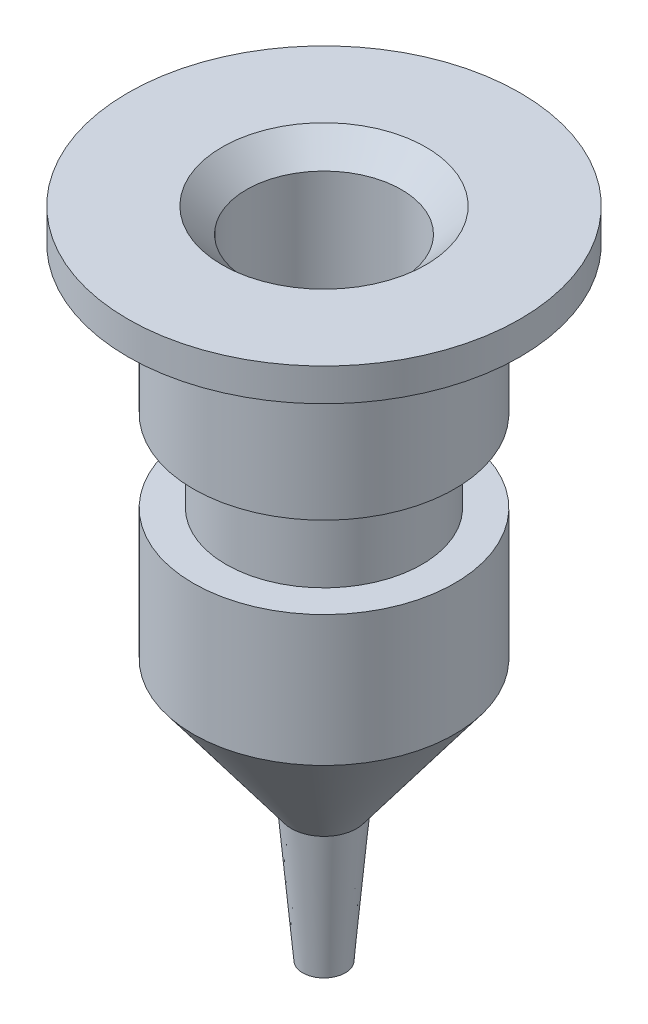
ISO-10303-21;
HEADER;
FILE_DESCRIPTION(('STEP AP214'),'2;1');
FILE_NAME('part.step','',(''),(''),'','','');
FILE_SCHEMA(('AUTOMOTIVE_DESIGN { 1 0 10303 214 1 1 1 1 }'));
ENDSEC;
DATA;
#1=APPLICATION_CONTEXT('core data for automotive mechanical design processes');
#2=APPLICATION_PROTOCOL_DEFINITION('international standard','automotive_design',2000,#1);
#3=PRODUCT_CONTEXT('',#1,'mechanical');
#4=PRODUCT('Part','Part','',(#3));
#5=PRODUCT_RELATED_PRODUCT_CATEGORY('part','',(#4));
#6=PRODUCT_DEFINITION_FORMATION('','',#4);
#7=PRODUCT_DEFINITION_CONTEXT('part definition',#1,'design');
#8=PRODUCT_DEFINITION('design','',#6,#7);
#9=PRODUCT_DEFINITION_SHAPE('','',#8);
#10=(LENGTH_UNIT() NAMED_UNIT(*) SI_UNIT(.MILLI.,.METRE.));
#11=(NAMED_UNIT(*) PLANE_ANGLE_UNIT() SI_UNIT($,.RADIAN.));
#12=(NAMED_UNIT(*) SI_UNIT($,.STERADIAN.) SOLID_ANGLE_UNIT());
#13=UNCERTAINTY_MEASURE_WITH_UNIT(LENGTH_MEASURE(1.E-05),#10,'distance_accuracy_value','');
#14=(GEOMETRIC_REPRESENTATION_CONTEXT(3) GLOBAL_UNCERTAINTY_ASSIGNED_CONTEXT((#13)) GLOBAL_UNIT_ASSIGNED_CONTEXT((#10,
#11,#12)) REPRESENTATION_CONTEXT('',''));
#15=CARTESIAN_POINT('',(0.,0.,0.));
#16=DIRECTION('',(0.,0.,1.));
#17=DIRECTION('',(1.,0.,0.));
#18=AXIS2_PLACEMENT_3D('',#15,#16,#17);
#19=CARTESIAN_POINT('',(3.,12.,0.));
#20=DIRECTION('',(0.,1.,0.));
#21=DIRECTION('',(0.,0.,1.));
#22=AXIS2_PLACEMENT_3D('',#19,#20,#21);
#23=PLANE('',#22);
#24=CARTESIAN_POINT('',(0.,12.,0.));
#25=DIRECTION('',(0.,1.,0.));
#26=DIRECTION('',(0.,0.,1.));
#27=AXIS2_PLACEMENT_3D('',#24,#25,#26);
#28=CIRCLE('',#27,4.00000000000001);
#29=CARTESIAN_POINT('',(0.,12.,4.00000000000001));
#30=VERTEX_POINT('',#29);
#31=EDGE_CURVE('E10',#30,#30,#28,.T.);
#32=ORIENTED_EDGE('',*,*,#31,.T.);
#33=EDGE_LOOP('',(#32));
#34=FACE_BOUND('',#33,.T.);
#35=CARTESIAN_POINT('',(0.,12.,0.));
#36=DIRECTION('',(0.,1.,0.));
#37=DIRECTION('',(0.,0.,1.));
#38=AXIS2_PLACEMENT_3D('',#35,#36,#37);
#39=CIRCLE('',#38,3.);
#40=CARTESIAN_POINT('',(0.,12.,3.));
#41=VERTEX_POINT('',#40);
#42=EDGE_CURVE('E86',#41,#41,#39,.T.);
#43=ORIENTED_EDGE('',*,*,#42,.F.);
#44=EDGE_LOOP('',(#43));
#45=FACE_BOUND('',#44,.T.);
#46=ADVANCED_FACE('F31',(#34,#45),#23,.T.);
#47=CARTESIAN_POINT('',(0.,0.,0.));
#48=DIRECTION('',(0.,1.,0.));
#49=DIRECTION('',(0.,0.,1.));
#50=AXIS2_PLACEMENT_3D('',#47,#48,#49);
#51=CYLINDRICAL_SURFACE('',#50,4.00000000000001);
#52=CARTESIAN_POINT('',(0.,8.0000000000382,0.));
#53=DIRECTION('',(0.,1.,0.));
#54=DIRECTION('',(0.,0.,1.));
#55=AXIS2_PLACEMENT_3D('',#52,#53,#54);
#56=CIRCLE('',#55,4.00000000000001);
#57=CARTESIAN_POINT('',(0.,8.0000000000382,4.00000000000001));
#58=VERTEX_POINT('',#57);
#59=EDGE_CURVE('E37',#58,#58,#56,.T.);
#60=ORIENTED_EDGE('',*,*,#59,.T.);
#61=EDGE_LOOP('',(#60));
#62=FACE_BOUND('',#61,.T.);
#63=ORIENTED_EDGE('',*,*,#31,.F.);
#64=EDGE_LOOP('',(#63));
#65=FACE_BOUND('',#64,.T.);
#66=ADVANCED_FACE('F94',(#62,#65),#51,.T.);
#67=CARTESIAN_POINT('',(0.,8.0000000000382,0.));
#68=DIRECTION('',(0.,1.,0.));
#69=DIRECTION('',(0.,0.,1.));
#70=AXIS2_PLACEMENT_3D('',#67,#68,#69);
#71=CONICAL_SURFACE('',#70,4.00000000000001,0.643501108796695);
#72=CARTESIAN_POINT('',(0.,4.0000000000191,0.));
#73=DIRECTION('',(0.,1.,0.));
#74=DIRECTION('',(0.,0.,1.));
#75=AXIS2_PLACEMENT_3D('',#72,#73,#74);
#76=CIRCLE('',#75,0.999999999964369);
#77=CARTESIAN_POINT('',(0.,4.0000000000191,0.999999999964369));
#78=VERTEX_POINT('',#77);
#79=EDGE_CURVE('E41',#78,#78,#76,.T.);
#80=CARTESIAN_POINT('',(0.,4.0000000000191,0.999999999964369));
#81=CARTESIAN_POINT('',(0.,4.04166666668597,1.03124999996474));
#82=CARTESIAN_POINT('',(0.,4.08333333335283,1.06249999996511));
#83=CARTESIAN_POINT('',(0.,4.16666666668656,1.12499999996585));
#84=CARTESIAN_POINT('',(0.,4.20833333335343,1.15624999996623));
#85=CARTESIAN_POINT('',(0.,4.29166666668716,1.21874999996697));
#86=CARTESIAN_POINT('',(0.,4.33333333335402,1.24999999996734));
#87=CARTESIAN_POINT('',(0.,4.41666666668776,1.31249999996808));
#88=CARTESIAN_POINT('',(0.,4.45833333335462,1.34374999996845));
#89=CARTESIAN_POINT('',(0.,4.54166666668835,1.4062499999692));
#90=CARTESIAN_POINT('',(0.,4.58333333335522,1.43749999996957));
#91=CARTESIAN_POINT('',(0.,4.66666666668895,1.49999999997031));
#92=CARTESIAN_POINT('',(0.,4.70833333335581,1.53124999997068));
#93=CARTESIAN_POINT('',(0.,4.79166666668955,1.59374999997142));
#94=CARTESIAN_POINT('',(0.,4.83333333335641,1.62499999997179));
#95=CARTESIAN_POINT('',(0.,4.91666666669014,1.68749999997254));
#96=CARTESIAN_POINT('',(0.,4.95833333335701,1.71874999997291));
#97=CARTESIAN_POINT('',(0.,5.04166666669074,1.78124999997365));
#98=CARTESIAN_POINT('',(0.,5.08333333335761,1.81249999997402));
#99=CARTESIAN_POINT('',(0.,5.16666666669134,1.87499999997476));
#100=CARTESIAN_POINT('',(0.,5.2083333333582,1.90624999997514));
#101=CARTESIAN_POINT('',(0.,5.29166666669193,1.96874999997588));
#102=CARTESIAN_POINT('',(0.,5.3333333333588,1.99999999997625));
#103=CARTESIAN_POINT('',(0.,5.41666666669253,2.06249999997699));
#104=CARTESIAN_POINT('',(0.,5.4583333333594,2.09374999997736));
#105=CARTESIAN_POINT('',(0.,5.54166666669313,2.15624999997811));
#106=CARTESIAN_POINT('',(0.,5.58333333335999,2.18749999997848));
#107=CARTESIAN_POINT('',(0.,5.66666666669372,2.24999999997922));
#108=CARTESIAN_POINT('',(0.,5.70833333336059,2.28124999997959));
#109=CARTESIAN_POINT('',(0.,5.79166666669432,2.34374999998033));
#110=CARTESIAN_POINT('',(0.,5.83333333336119,2.3749999999807));
#111=CARTESIAN_POINT('',(0.,5.91666666669492,2.43749999998145));
#112=CARTESIAN_POINT('',(0.,5.95833333336178,2.46874999998182));
#113=CARTESIAN_POINT('',(0.,6.04166666669551,2.53124999998256));
#114=CARTESIAN_POINT('',(0.,6.08333333336238,2.56249999998293));
#115=CARTESIAN_POINT('',(0.,6.16666666669611,2.62499999998367));
#116=CARTESIAN_POINT('',(0.,6.20833333336298,2.65624999998405));
#117=CARTESIAN_POINT('',(0.,6.29166666669671,2.71874999998479));
#118=CARTESIAN_POINT('',(0.,6.33333333336357,2.74999999998516));
#119=CARTESIAN_POINT('',(0.,6.41666666669731,2.8124999999859));
#120=CARTESIAN_POINT('',(0.,6.45833333336417,2.84374999998627));
#121=CARTESIAN_POINT('',(0.,6.5416666666979,2.90624999998702));
#122=CARTESIAN_POINT('',(0.,6.58333333336477,2.93749999998739));
#123=CARTESIAN_POINT('',(0.,6.6666666666985,2.99999999998813));
#124=CARTESIAN_POINT('',(0.,6.70833333336536,3.0312499999885));
#125=CARTESIAN_POINT('',(0.,6.7916666666991,3.09374999998924));
#126=CARTESIAN_POINT('',(0.,6.83333333336596,3.12499999998961));
#127=CARTESIAN_POINT('',(0.,6.91666666669969,3.18749999999036));
#128=CARTESIAN_POINT('',(0.,6.95833333336656,3.21874999999073));
#129=CARTESIAN_POINT('',(0.,7.04166666670029,3.28124999999147));
#130=CARTESIAN_POINT('',(0.,7.08333333336715,3.31249999999184));
#131=CARTESIAN_POINT('',(0.,7.16666666670089,3.37499999999258));
#132=CARTESIAN_POINT('',(0.,7.20833333336775,3.40624999999296));
#133=CARTESIAN_POINT('',(0.,7.29166666670148,3.4687499999937));
#134=CARTESIAN_POINT('',(0.,7.33333333336835,3.49999999999407));
#135=CARTESIAN_POINT('',(0.,7.41666666670208,3.56249999999481));
#136=CARTESIAN_POINT('',(0.,7.45833333336894,3.59374999999518));
#137=CARTESIAN_POINT('',(0.,7.54166666670268,3.65624999999593));
#138=CARTESIAN_POINT('',(0.,7.58333333336954,3.6874999999963));
#139=CARTESIAN_POINT('',(0.,7.66666666670327,3.74999999999704));
#140=CARTESIAN_POINT('',(0.,7.70833333337014,3.78124999999741));
#141=CARTESIAN_POINT('',(0.,7.79166666670387,3.84374999999815));
#142=CARTESIAN_POINT('',(0.,7.83333333337074,3.87499999999852));
#143=CARTESIAN_POINT('',(0.,7.91666666670447,3.93749999999927));
#144=CARTESIAN_POINT('',(0.,7.95833333337133,3.96874999999964));
#145=CARTESIAN_POINT('',(0.,8.0000000000382,4.00000000000001));
#146=B_SPLINE_CURVE_WITH_KNOTS('',3,(#80,#81,#82,#83,#84,#85,#86,#87,#88,#89,#90,#91,#92,#93,
#94,#95,#96,#97,#98,#99,#100,#101,#102,#103,#104,#105,#106,#107,#108,#109,#110,#111,#112,#113,
#114,#115,#116,#117,#118,#119,#120,#121,#122,#123,#124,#125,#126,#127,#128,#129,#130,#131,#132,
#133,#134,#135,#136,#137,#138,#139,#140,#141,#142,#143,#144,#145),.UNSPECIFIED.,.F.,.F.,(4,2,2,
2,2,2,2,2,2,2,2,2,2,2,2,2,2,2,2,2,2,2,2,2,2,2,2,2,2,2,2,2,4),(0.,0.156250000001146,
0.312500000002292,0.468750000003437,0.625000000004583,0.781250000005729,0.937500000006875,
1.09375000000802,1.25000000000917,1.40625000001031,1.56250000001146,1.7187500000126,
1.87500000001375,2.03125000001489,2.18750000001604,2.34375000001719,2.50000000001833,
2.65625000001948,2.81250000002062,2.96875000002177,3.12500000002292,3.28125000002406,
3.43750000002521,3.59375000002635,3.7500000000275,3.90625000002864,4.06250000002979,
4.21875000003094,4.37500000003208,4.53125000003323,4.68750000003437,4.84375000003552,
5.00000000003667),.UNSPECIFIED.);
#147=EDGE_CURVE('BSEAM98',#78,#58,#146,.T.);
#148=ORIENTED_EDGE('',*,*,#79,.T.);
#149=ORIENTED_EDGE('',*,*,#59,.F.);
#150=ORIENTED_EDGE('',*,*,#147,.T.);
#151=ORIENTED_EDGE('',*,*,#147,.F.);
#152=EDGE_LOOP('',(#148,#150,#149,#151));
#153=FACE_BOUND('',#152,.T.);
#154=ADVANCED_FACE('F98',(#153),#71,.T.);
#155=CARTESIAN_POINT('',(0.,4.0000000000191,0.));
#156=DIRECTION('',(0.,1.,0.));
#157=DIRECTION('',(0.,0.,1.));
#158=AXIS2_PLACEMENT_3D('',#155,#156,#157);
#159=CONICAL_SURFACE('',#158,0.999999999964369,0.0872777129484037);
#160=CARTESIAN_POINT('',(0.,0.,0.));
#161=DIRECTION('',(0.,1.,0.));
#162=DIRECTION('',(0.,0.,1.));
#163=AXIS2_PLACEMENT_3D('',#160,#161,#162);
#164=CIRCLE('',#163,0.649999999966961);
#165=CARTESIAN_POINT('',(0.,0.,0.649999999966961));
#166=VERTEX_POINT('',#165);
#167=EDGE_CURVE('E45',#166,#166,#164,.T.);
#168=ORIENTED_EDGE('',*,*,#167,.T.);
#169=EDGE_LOOP('',(#168));
#170=FACE_BOUND('',#169,.T.);
#171=ORIENTED_EDGE('',*,*,#79,.F.);
#172=EDGE_LOOP('',(#171));
#173=FACE_BOUND('',#172,.T.);
#174=ADVANCED_FACE('F102',(#170,#173),#159,.T.);
#175=CARTESIAN_POINT('',(0.649999999966961,0.,0.));
#176=DIRECTION('',(0.,-1.,0.));
#177=DIRECTION('',(0.,0.,-1.));
#178=AXIS2_PLACEMENT_3D('',#175,#176,#177);
#179=PLANE('',#178);
#180=CARTESIAN_POINT('',(0.,0.,0.));
#181=DIRECTION('',(0.,1.,0.));
#182=DIRECTION('',(0.,0.,1.));
#183=AXIS2_PLACEMENT_3D('',#180,#181,#182);
#184=CIRCLE('',#183,0.400000000103073);
#185=CARTESIAN_POINT('',(0.,0.,0.400000000103073));
#186=VERTEX_POINT('',#185);
#187=EDGE_CURVE('E50',#186,#186,#184,.T.);
#188=ORIENTED_EDGE('',*,*,#187,.T.);
#189=EDGE_LOOP('',(#188));
#190=FACE_BOUND('',#189,.T.);
#191=ORIENTED_EDGE('',*,*,#167,.F.);
#192=EDGE_LOOP('',(#191));
#193=FACE_BOUND('',#192,.T.);
#194=ADVANCED_FACE('F109',(#190,#193),#179,.T.);
#195=CARTESIAN_POINT('',(0.,0.,0.));
#196=DIRECTION('',(0.,1.,0.));
#197=DIRECTION('',(0.,0.,1.));
#198=AXIS2_PLACEMENT_3D('',#195,#196,#197);
#199=CYLINDRICAL_SURFACE('',#198,0.400000000103073);
#200=CARTESIAN_POINT('',(0.,4.99999999995186,0.));
#201=DIRECTION('',(0.,1.,0.));
#202=DIRECTION('',(0.,0.,1.));
#203=AXIS2_PLACEMENT_3D('',#200,#201,#202);
#204=CIRCLE('',#203,0.400000000103073);
#205=CARTESIAN_POINT('',(0.,4.99999999995186,0.400000000103073));
#206=VERTEX_POINT('',#205);
#207=EDGE_CURVE('E53',#206,#206,#204,.T.);
#208=ORIENTED_EDGE('',*,*,#207,.T.);
#209=EDGE_LOOP('',(#208));
#210=FACE_BOUND('',#209,.T.);
#211=ORIENTED_EDGE('',*,*,#187,.F.);
#212=EDGE_LOOP('',(#211));
#213=FACE_BOUND('',#212,.T.);
#214=ADVANCED_FACE('F113',(#210,#213),#199,.F.);
#215=CARTESIAN_POINT('',(0.,4.99999999995186,0.));
#216=DIRECTION('',(0.,1.,0.));
#217=DIRECTION('',(0.,0.,1.));
#218=AXIS2_PLACEMENT_3D('',#215,#216,#217);
#219=CONICAL_SURFACE('',#218,0.400000000103073,1.0471975511966);
#220=CARTESIAN_POINT('',(0.,5.34641016146102,0.));
#221=DIRECTION('',(0.,1.,0.));
#222=DIRECTION('',(0.,0.,1.));
#223=AXIS2_PLACEMENT_3D('',#220,#221,#222);
#224=CIRCLE('',#223,1.00000000009508);
#225=CARTESIAN_POINT('',(0.,5.34641016146102,1.00000000009508));
#226=VERTEX_POINT('',#225);
#227=EDGE_CURVE('E56',#226,#226,#224,.T.);
#228=ORIENTED_EDGE('',*,*,#227,.T.);
#229=EDGE_LOOP('',(#228));
#230=FACE_BOUND('',#229,.T.);
#231=ORIENTED_EDGE('',*,*,#207,.F.);
#232=EDGE_LOOP('',(#231));
#233=FACE_BOUND('',#232,.T.);
#234=ADVANCED_FACE('F117',(#230,#233),#219,.F.);
#235=CARTESIAN_POINT('',(0.,0.,0.));
#236=DIRECTION('',(0.,1.,0.));
#237=DIRECTION('',(0.,0.,1.));
#238=AXIS2_PLACEMENT_3D('',#235,#236,#237);
#239=CYLINDRICAL_SURFACE('',#238,1.00000000009508);
#240=CARTESIAN_POINT('',(0.,9.999999999995,0.));
#241=DIRECTION('',(0.,1.,0.));
#242=DIRECTION('',(0.,0.,1.));
#243=AXIS2_PLACEMENT_3D('',#240,#241,#242);
#244=CIRCLE('',#243,1.00000000009508);
#245=CARTESIAN_POINT('',(0.,9.999999999995,1.00000000009508));
#246=VERTEX_POINT('',#245);
#247=EDGE_CURVE('E59',#246,#246,#244,.T.);
#248=ORIENTED_EDGE('',*,*,#247,.T.);
#249=EDGE_LOOP('',(#248));
#250=FACE_BOUND('',#249,.T.);
#251=ORIENTED_EDGE('',*,*,#227,.F.);
#252=EDGE_LOOP('',(#251));
#253=FACE_BOUND('',#252,.T.);
#254=ADVANCED_FACE('F121',(#250,#253),#239,.F.);
#255=CARTESIAN_POINT('',(0.,9.999999999995,0.));
#256=DIRECTION('',(0.,1.,0.));
#257=DIRECTION('',(0.,0.,1.));
#258=AXIS2_PLACEMENT_3D('',#255,#256,#257);
#259=CONICAL_SURFACE('',#258,1.00000000009508,1.0471975511966);
#260=CARTESIAN_POINT('',(0.,10.7909698687585,0.));
#261=DIRECTION('',(0.,1.,0.));
#262=DIRECTION('',(0.,0.,1.));
#263=AXIS2_PLACEMENT_3D('',#260,#261,#262);
#264=CIRCLE('',#263,2.37000000004951);
#265=CARTESIAN_POINT('',(0.,10.7909698687585,2.37000000004951));
#266=VERTEX_POINT('',#265);
#267=EDGE_CURVE('E62',#266,#266,#264,.T.);
#268=ORIENTED_EDGE('',*,*,#267,.T.);
#269=EDGE_LOOP('',(#268));
#270=FACE_BOUND('',#269,.T.);
#271=ORIENTED_EDGE('',*,*,#247,.F.);
#272=EDGE_LOOP('',(#271));
#273=FACE_BOUND('',#272,.T.);
#274=ADVANCED_FACE('F125',(#270,#273),#259,.F.);
#275=CARTESIAN_POINT('',(0.,0.,0.));
#276=DIRECTION('',(0.,1.,0.));
#277=DIRECTION('',(0.,0.,1.));
#278=AXIS2_PLACEMENT_3D('',#275,#276,#277);
#279=CYLINDRICAL_SURFACE('',#278,2.37000000004951);
#280=CARTESIAN_POINT('',(0.,19.2499999999687,0.));
#281=DIRECTION('',(0.,1.,0.));
#282=DIRECTION('',(0.,0.,1.));
#283=AXIS2_PLACEMENT_3D('',#280,#281,#282);
#284=CIRCLE('',#283,2.37000000004951);
#285=CARTESIAN_POINT('',(0.,19.2499999999687,2.37000000004951));
#286=VERTEX_POINT('',#285);
#287=EDGE_CURVE('E65',#286,#286,#284,.T.);
#288=ORIENTED_EDGE('',*,*,#287,.T.);
#289=EDGE_LOOP('',(#288));
#290=FACE_BOUND('',#289,.T.);
#291=ORIENTED_EDGE('',*,*,#267,.F.);
#292=EDGE_LOOP('',(#291));
#293=FACE_BOUND('',#292,.T.);
#294=ADVANCED_FACE('F129',(#290,#293),#279,.F.);
#295=CARTESIAN_POINT('',(0.,19.2499999999687,0.));
#296=DIRECTION('',(0.,1.,0.));
#297=DIRECTION('',(0.,0.,1.));
#298=AXIS2_PLACEMENT_3D('',#295,#296,#297);
#299=CONICAL_SURFACE('',#298,2.37000000004951,0.785398163397448);
#300=CARTESIAN_POINT('',(0.,20.,0.));
#301=DIRECTION('',(0.,1.,0.));
#302=DIRECTION('',(0.,0.,1.));
#303=AXIS2_PLACEMENT_3D('',#300,#301,#302);
#304=CIRCLE('',#303,3.12000000008084);
#305=CARTESIAN_POINT('',(0.,20.,3.12000000008084));
#306=VERTEX_POINT('',#305);
#307=EDGE_CURVE('E68',#306,#306,#304,.T.);
#308=ORIENTED_EDGE('',*,*,#307,.T.);
#309=EDGE_LOOP('',(#308));
#310=FACE_BOUND('',#309,.T.);
#311=ORIENTED_EDGE('',*,*,#287,.F.);
#312=EDGE_LOOP('',(#311));
#313=FACE_BOUND('',#312,.T.);
#314=ADVANCED_FACE('F133',(#310,#313),#299,.F.);
#315=CARTESIAN_POINT('',(3.12000000008084,20.,0.));
#316=DIRECTION('',(0.,1.,0.));
#317=DIRECTION('',(0.,0.,1.));
#318=AXIS2_PLACEMENT_3D('',#315,#316,#317);
#319=PLANE('',#318);
#320=CARTESIAN_POINT('',(0.,20.,0.));
#321=DIRECTION('',(0.,1.,0.));
#322=DIRECTION('',(0.,0.,1.));
#323=AXIS2_PLACEMENT_3D('',#320,#321,#322);
#324=CIRCLE('',#323,6.);
#325=CARTESIAN_POINT('',(0.,20.,6.));
#326=VERTEX_POINT('',#325);
#327=EDGE_CURVE('E71',#326,#326,#324,.T.);
#328=ORIENTED_EDGE('',*,*,#327,.T.);
#329=EDGE_LOOP('',(#328));
#330=FACE_BOUND('',#329,.T.);
#331=ORIENTED_EDGE('',*,*,#307,.F.);
#332=EDGE_LOOP('',(#331));
#333=FACE_BOUND('',#332,.T.);
#334=ADVANCED_FACE('F137',(#330,#333),#319,.T.);
#335=CARTESIAN_POINT('',(0.,0.,0.));
#336=DIRECTION('',(0.,1.,0.));
#337=DIRECTION('',(0.,0.,1.));
#338=AXIS2_PLACEMENT_3D('',#335,#336,#337);
#339=CYLINDRICAL_SURFACE('',#338,6.);
#340=CARTESIAN_POINT('',(0.,19.,0.));
#341=DIRECTION('',(0.,1.,0.));
#342=DIRECTION('',(0.,0.,1.));
#343=AXIS2_PLACEMENT_3D('',#340,#341,#342);
#344=CIRCLE('',#343,6.);
#345=CARTESIAN_POINT('',(0.,19.,6.));
#346=VERTEX_POINT('',#345);
#347=EDGE_CURVE('E74',#346,#346,#344,.T.);
#348=ORIENTED_EDGE('',*,*,#347,.T.);
#349=EDGE_LOOP('',(#348));
#350=FACE_BOUND('',#349,.T.);
#351=ORIENTED_EDGE('',*,*,#327,.F.);
#352=EDGE_LOOP('',(#351));
#353=FACE_BOUND('',#352,.T.);
#354=ADVANCED_FACE('F141',(#350,#353),#339,.T.);
#355=CARTESIAN_POINT('',(6.,19.,0.));
#356=DIRECTION('',(0.,-1.,0.));
#357=DIRECTION('',(0.,0.,-1.));
#358=AXIS2_PLACEMENT_3D('',#355,#356,#357);
#359=PLANE('',#358);
#360=CARTESIAN_POINT('',(0.,19.,0.));
#361=DIRECTION('',(0.,1.,0.));
#362=DIRECTION('',(0.,0.,1.));
#363=AXIS2_PLACEMENT_3D('',#360,#361,#362);
#364=CIRCLE('',#363,4.00000000000001);
#365=CARTESIAN_POINT('',(0.,19.,4.00000000000001));
#366=VERTEX_POINT('',#365);
#367=EDGE_CURVE('E77',#366,#366,#364,.T.);
#368=ORIENTED_EDGE('',*,*,#367,.T.);
#369=EDGE_LOOP('',(#368));
#370=FACE_BOUND('',#369,.T.);
#371=ORIENTED_EDGE('',*,*,#347,.F.);
#372=EDGE_LOOP('',(#371));
#373=FACE_BOUND('',#372,.T.);
#374=ADVANCED_FACE('F145',(#370,#373),#359,.T.);
#375=CARTESIAN_POINT('',(0.,0.,0.));
#376=DIRECTION('',(0.,1.,0.));
#377=DIRECTION('',(0.,0.,1.));
#378=AXIS2_PLACEMENT_3D('',#375,#376,#377);
#379=CYLINDRICAL_SURFACE('',#378,4.00000000000001);
#380=CARTESIAN_POINT('',(0.,14.5,0.));
#381=DIRECTION('',(0.,1.,0.));
#382=DIRECTION('',(0.,0.,1.));
#383=AXIS2_PLACEMENT_3D('',#380,#381,#382);
#384=CIRCLE('',#383,4.00000000000001);
#385=CARTESIAN_POINT('',(0.,14.5,4.00000000000001));
#386=VERTEX_POINT('',#385);
#387=EDGE_CURVE('E80',#386,#386,#384,.T.);
#388=ORIENTED_EDGE('',*,*,#387,.T.);
#389=EDGE_LOOP('',(#388));
#390=FACE_BOUND('',#389,.T.);
#391=ORIENTED_EDGE('',*,*,#367,.F.);
#392=EDGE_LOOP('',(#391));
#393=FACE_BOUND('',#392,.T.);
#394=ADVANCED_FACE('F149',(#390,#393),#379,.T.);
#395=CARTESIAN_POINT('',(4.00000000000001,14.5,0.));
#396=DIRECTION('',(0.,-1.,0.));
#397=DIRECTION('',(0.,0.,-1.));
#398=AXIS2_PLACEMENT_3D('',#395,#396,#397);
#399=PLANE('',#398);
#400=CARTESIAN_POINT('',(0.,14.5,0.));
#401=DIRECTION('',(0.,1.,0.));
#402=DIRECTION('',(0.,0.,1.));
#403=AXIS2_PLACEMENT_3D('',#400,#401,#402);
#404=CIRCLE('',#403,3.);
#405=CARTESIAN_POINT('',(0.,14.5,3.));
#406=VERTEX_POINT('',#405);
#407=EDGE_CURVE('E83',#406,#406,#404,.T.);
#408=ORIENTED_EDGE('',*,*,#407,.T.);
#409=EDGE_LOOP('',(#408));
#410=FACE_BOUND('',#409,.T.);
#411=ORIENTED_EDGE('',*,*,#387,.F.);
#412=EDGE_LOOP('',(#411));
#413=FACE_BOUND('',#412,.T.);
#414=ADVANCED_FACE('F153',(#410,#413),#399,.T.);
#415=CARTESIAN_POINT('',(0.,0.,0.));
#416=DIRECTION('',(0.,1.,0.));
#417=DIRECTION('',(0.,0.,1.));
#418=AXIS2_PLACEMENT_3D('',#415,#416,#417);
#419=CYLINDRICAL_SURFACE('',#418,3.);
#420=ORIENTED_EDGE('',*,*,#42,.T.);
#421=EDGE_LOOP('',(#420));
#422=FACE_BOUND('',#421,.T.);
#423=ORIENTED_EDGE('',*,*,#407,.F.);
#424=EDGE_LOOP('',(#423));
#425=FACE_BOUND('',#424,.T.);
#426=ADVANCED_FACE('F90',(#422,#425),#419,.T.);
#427=CLOSED_SHELL('',(#46,#66,#154,#174,#194,#214,#234,#254,#274,#294,#314,#334,#354,#374,#394,
#414,#426));
#428=MANIFOLD_SOLID_BREP('B2',#427);
#429=ADVANCED_BREP_SHAPE_REPRESENTATION('',(#18,#428),#14);
#430=SHAPE_DEFINITION_REPRESENTATION(#9,#429);
ENDSEC;
END-ISO-10303-21;
